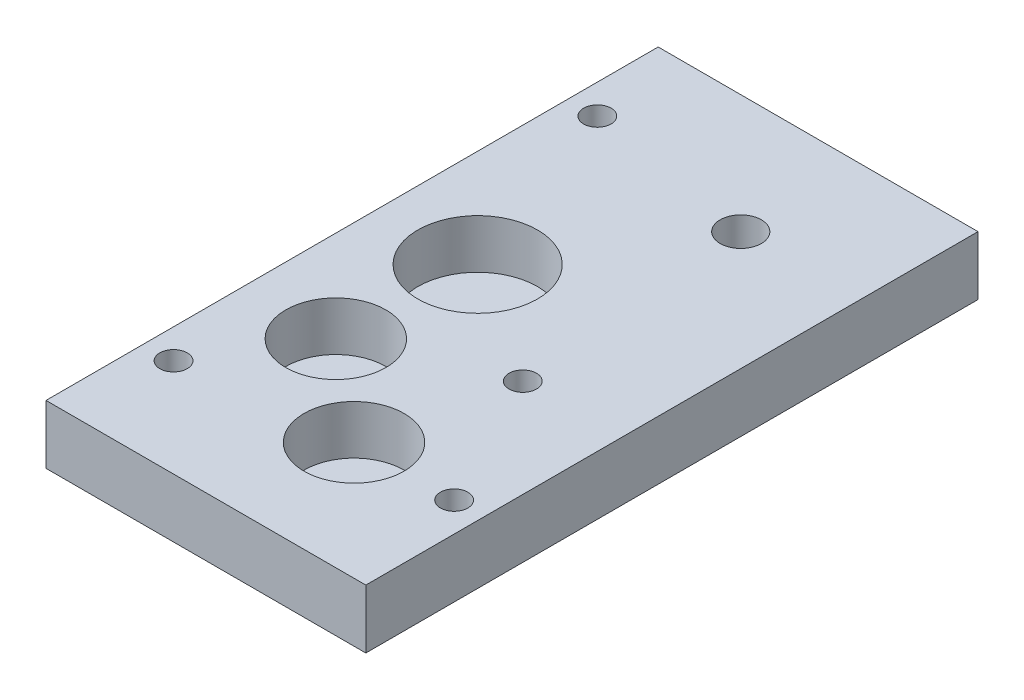
ISO-10303-21;
HEADER;
FILE_DESCRIPTION(('STEP AP214'),'2;1');
FILE_NAME('part.step','',(''),(''),'','','');
FILE_SCHEMA(('AUTOMOTIVE_DESIGN { 1 0 10303 214 1 1 1 1 }'));
ENDSEC;
DATA;
#1=APPLICATION_CONTEXT('core data for automotive mechanical design processes');
#2=APPLICATION_PROTOCOL_DEFINITION('international standard','automotive_design',2000,#1);
#3=PRODUCT_CONTEXT('',#1,'mechanical');
#4=PRODUCT('Part','Part','',(#3));
#5=PRODUCT_RELATED_PRODUCT_CATEGORY('part','',(#4));
#6=PRODUCT_DEFINITION_FORMATION('','',#4);
#7=PRODUCT_DEFINITION_CONTEXT('part definition',#1,'design');
#8=PRODUCT_DEFINITION('design','',#6,#7);
#9=PRODUCT_DEFINITION_SHAPE('','',#8);
#10=(LENGTH_UNIT() NAMED_UNIT(*) SI_UNIT(.MILLI.,.METRE.));
#11=(NAMED_UNIT(*) PLANE_ANGLE_UNIT() SI_UNIT($,.RADIAN.));
#12=(NAMED_UNIT(*) SI_UNIT($,.STERADIAN.) SOLID_ANGLE_UNIT());
#13=UNCERTAINTY_MEASURE_WITH_UNIT(LENGTH_MEASURE(1.E-05),#10,'distance_accuracy_value','');
#14=(GEOMETRIC_REPRESENTATION_CONTEXT(3) GLOBAL_UNCERTAINTY_ASSIGNED_CONTEXT((#13)) GLOBAL_UNIT_ASSIGNED_CONTEXT((#10,
#11,#12)) REPRESENTATION_CONTEXT('',''));
#15=CARTESIAN_POINT('',(0.,0.,0.));
#16=DIRECTION('',(0.,0.,1.));
#17=DIRECTION('',(1.,0.,0.));
#18=AXIS2_PLACEMENT_3D('',#15,#16,#17);
#19=CARTESIAN_POINT('',(-5.,3.,-14.2));
#20=DIRECTION('',(0.,0.,-1.));
#21=DIRECTION('',(-1.,0.,0.));
#22=AXIS2_PLACEMENT_3D('',#19,#20,#21);
#23=PLANE('',#22);
#24=DIRECTION('',(1.,0.,0.));
#25=VECTOR('',#24,1.);
#26=CARTESIAN_POINT('',(-5.,0.,-14.2));
#27=LINE('',#26,#25);
#28=CARTESIAN_POINT('',(-5.,0.,-14.2));
#29=VERTEX_POINT('',#28);
#30=CARTESIAN_POINT('',(11.3,0.,-14.2));
#31=VERTEX_POINT('',#30);
#32=EDGE_CURVE('E109',#29,#31,#27,.T.);
#33=ORIENTED_EDGE('',*,*,#32,.F.);
#34=DIRECTION('',(0.,-1.,0.));
#35=VECTOR('',#34,1.);
#36=CARTESIAN_POINT('',(-5.,3.,-14.2));
#37=LINE('',#36,#35);
#38=CARTESIAN_POINT('',(-5.,3.,-14.2));
#39=VERTEX_POINT('',#38);
#40=EDGE_CURVE('E12',#39,#29,#37,.T.);
#41=ORIENTED_EDGE('',*,*,#40,.F.);
#42=DIRECTION('',(1.,0.,0.));
#43=VECTOR('',#42,1.);
#44=CARTESIAN_POINT('',(-5.,3.,-14.2));
#45=LINE('',#44,#43);
#46=CARTESIAN_POINT('',(11.3,3.,-14.2));
#47=VERTEX_POINT('',#46);
#48=EDGE_CURVE('E103',#39,#47,#45,.T.);
#49=ORIENTED_EDGE('',*,*,#48,.T.);
#50=DIRECTION('',(0.,-1.,0.));
#51=VECTOR('',#50,1.);
#52=CARTESIAN_POINT('',(11.3,3.,-14.2));
#53=LINE('',#52,#51);
#54=EDGE_CURVE('E82',#47,#31,#53,.T.);
#55=ORIENTED_EDGE('',*,*,#54,.T.);
#56=EDGE_LOOP('',(#33,#41,#49,#55));
#57=FACE_BOUND('',#56,.T.);
#58=ADVANCED_FACE('F41',(#57),#23,.T.);
#59=CARTESIAN_POINT('',(-5.,3.,-14.2));
#60=DIRECTION('',(1.,0.,0.));
#61=DIRECTION('',(0.,0.,-1.));
#62=AXIS2_PLACEMENT_3D('',#59,#60,#61);
#63=PLANE('',#62);
#64=DIRECTION('',(0.,0.,1.));
#65=VECTOR('',#64,1.);
#66=CARTESIAN_POINT('',(-5.,0.,-14.2));
#67=LINE('',#66,#65);
#68=CARTESIAN_POINT('',(-5.,0.,17.));
#69=VERTEX_POINT('',#68);
#70=EDGE_CURVE('E74',#29,#69,#67,.T.);
#71=ORIENTED_EDGE('',*,*,#70,.T.);
#72=DIRECTION('',(0.,-1.,0.));
#73=VECTOR('',#72,1.);
#74=CARTESIAN_POINT('',(-5.,3.,17.));
#75=LINE('',#74,#73);
#76=CARTESIAN_POINT('',(-5.,3.,17.));
#77=VERTEX_POINT('',#76);
#78=EDGE_CURVE('E50',#77,#69,#75,.T.);
#79=ORIENTED_EDGE('',*,*,#78,.F.);
#80=DIRECTION('',(0.,0.,1.));
#81=VECTOR('',#80,1.);
#82=CARTESIAN_POINT('',(-5.,3.,-14.2));
#83=LINE('',#82,#81);
#84=EDGE_CURVE('E92',#39,#77,#83,.T.);
#85=ORIENTED_EDGE('',*,*,#84,.F.);
#86=ORIENTED_EDGE('',*,*,#40,.T.);
#87=EDGE_LOOP('',(#71,#79,#85,#86));
#88=FACE_BOUND('',#87,.T.);
#89=ADVANCED_FACE('F191',(#88),#63,.F.);
#90=CARTESIAN_POINT('',(-5.,3.,17.));
#91=DIRECTION('',(0.,0.,-1.));
#92=DIRECTION('',(-1.,0.,0.));
#93=AXIS2_PLACEMENT_3D('',#90,#91,#92);
#94=PLANE('',#93);
#95=DIRECTION('',(1.,0.,0.));
#96=VECTOR('',#95,1.);
#97=CARTESIAN_POINT('',(-5.,0.,17.));
#98=LINE('',#97,#96);
#99=CARTESIAN_POINT('',(11.3,0.,17.));
#100=VERTEX_POINT('',#99);
#101=EDGE_CURVE('E99',#69,#100,#98,.T.);
#102=ORIENTED_EDGE('',*,*,#101,.T.);
#103=DIRECTION('',(0.,-1.,0.));
#104=VECTOR('',#103,1.);
#105=CARTESIAN_POINT('',(11.3,3.,17.));
#106=LINE('',#105,#104);
#107=CARTESIAN_POINT('',(11.3,3.,17.));
#108=VERTEX_POINT('',#107);
#109=EDGE_CURVE('E96',#108,#100,#106,.T.);
#110=ORIENTED_EDGE('',*,*,#109,.F.);
#111=DIRECTION('',(1.,0.,0.));
#112=VECTOR('',#111,1.);
#113=CARTESIAN_POINT('',(-5.,3.,17.));
#114=LINE('',#113,#112);
#115=EDGE_CURVE('E87',#77,#108,#114,.T.);
#116=ORIENTED_EDGE('',*,*,#115,.F.);
#117=ORIENTED_EDGE('',*,*,#78,.T.);
#118=EDGE_LOOP('',(#102,#110,#116,#117));
#119=FACE_BOUND('',#118,.T.);
#120=ADVANCED_FACE('F97',(#119),#94,.F.);
#121=CARTESIAN_POINT('',(11.3,3.,-14.2));
#122=DIRECTION('',(1.,0.,0.));
#123=DIRECTION('',(0.,0.,-1.));
#124=AXIS2_PLACEMENT_3D('',#121,#122,#123);
#125=PLANE('',#124);
#126=DIRECTION('',(0.,0.,1.));
#127=VECTOR('',#126,1.);
#128=CARTESIAN_POINT('',(11.3,0.,-14.2));
#129=LINE('',#128,#127);
#130=EDGE_CURVE('E112',#31,#100,#129,.T.);
#131=ORIENTED_EDGE('',*,*,#130,.F.);
#132=ORIENTED_EDGE('',*,*,#54,.F.);
#133=DIRECTION('',(0.,0.,1.));
#134=VECTOR('',#133,1.);
#135=CARTESIAN_POINT('',(11.3,3.,-14.2));
#136=LINE('',#135,#134);
#137=EDGE_CURVE('E91',#47,#108,#136,.T.);
#138=ORIENTED_EDGE('',*,*,#137,.T.);
#139=ORIENTED_EDGE('',*,*,#109,.T.);
#140=EDGE_LOOP('',(#131,#132,#138,#139));
#141=FACE_BOUND('',#140,.T.);
#142=ADVANCED_FACE('F102',(#141),#125,.T.);
#143=CARTESIAN_POINT('',(0.,3.,0.));
#144=DIRECTION('',(0.,-1.,0.));
#145=DIRECTION('',(0.,0.,-1.));
#146=AXIS2_PLACEMENT_3D('',#143,#144,#145);
#147=PLANE('',#146);
#148=CARTESIAN_POINT('',(-3.50000000000003,3.,-9.6));
#149=DIRECTION('',(0.,-1.,0.));
#150=DIRECTION('',(0.,0.,-1.));
#151=AXIS2_PLACEMENT_3D('',#148,#149,#150);
#152=CIRCLE('',#151,0.7);
#153=CARTESIAN_POINT('',(-3.50000000000003,3.,-10.3));
#154=VERTEX_POINT('',#153);
#155=EDGE_CURVE('E123',#154,#154,#152,.T.);
#156=ORIENTED_EDGE('',*,*,#155,.T.);
#157=EDGE_LOOP('',(#156));
#158=FACE_BOUND('',#157,.T.);
#159=CARTESIAN_POINT('',(9.80000000000005,3.,11.));
#160=DIRECTION('',(0.,-1.,0.));
#161=DIRECTION('',(0.,0.,-1.));
#162=AXIS2_PLACEMENT_3D('',#159,#160,#161);
#163=CIRCLE('',#162,0.699999999999999);
#164=CARTESIAN_POINT('',(9.80000000000005,3.,10.3));
#165=VERTEX_POINT('',#164);
#166=EDGE_CURVE('E214',#165,#165,#163,.T.);
#167=ORIENTED_EDGE('',*,*,#166,.T.);
#168=EDGE_LOOP('',(#167));
#169=FACE_BOUND('',#168,.T.);
#170=CARTESIAN_POINT('',(-3.50000000000022,3.,12.));
#171=DIRECTION('',(0.,-1.,0.));
#172=DIRECTION('',(0.,0.,-1.));
#173=AXIS2_PLACEMENT_3D('',#170,#171,#172);
#174=CIRCLE('',#173,0.7);
#175=CARTESIAN_POINT('',(-3.50000000000022,3.,11.3));
#176=VERTEX_POINT('',#175);
#177=EDGE_CURVE('E218',#176,#176,#174,.T.);
#178=ORIENTED_EDGE('',*,*,#177,.T.);
#179=EDGE_LOOP('',(#178));
#180=FACE_BOUND('',#179,.T.);
#181=CARTESIAN_POINT('',(6.29999999999997,3.,4.00000000000006));
#182=DIRECTION('',(0.,-1.,0.));
#183=DIRECTION('',(0.,0.,-1.));
#184=AXIS2_PLACEMENT_3D('',#181,#182,#183);
#185=CIRCLE('',#184,0.7);
#186=CARTESIAN_POINT('',(6.29999999999997,3.,3.30000000000006));
#187=VERTEX_POINT('',#186);
#188=EDGE_CURVE('E222',#187,#187,#185,.T.);
#189=ORIENTED_EDGE('',*,*,#188,.T.);
#190=EDGE_LOOP('',(#189));
#191=FACE_BOUND('',#190,.T.);
#192=CARTESIAN_POINT('',(5.25646038971304,3.,-8.15227723837811));
#193=DIRECTION('',(0.,-1.,0.));
#194=DIRECTION('',(0.,0.,-1.));
#195=AXIS2_PLACEMENT_3D('',#192,#193,#194);
#196=CIRCLE('',#195,1.05);
#197=CARTESIAN_POINT('',(5.25646038971304,3.,-9.20227723837811));
#198=VERTEX_POINT('',#197);
#199=EDGE_CURVE('E158',#198,#198,#196,.T.);
#200=ORIENTED_EDGE('',*,*,#199,.T.);
#201=EDGE_LOOP('',(#200));
#202=FACE_BOUND('',#201,.T.);
#203=CARTESIAN_POINT('',(4.7,3.,11.));
#204=DIRECTION('',(0.,-1.,0.));
#205=DIRECTION('',(0.,0.,-1.));
#206=AXIS2_PLACEMENT_3D('',#203,#204,#205);
#207=CIRCLE('',#206,2.55);
#208=CARTESIAN_POINT('',(4.7,3.,8.44999999999999));
#209=VERTEX_POINT('',#208);
#210=EDGE_CURVE('E159',#209,#209,#207,.T.);
#211=ORIENTED_EDGE('',*,*,#210,.T.);
#212=EDGE_LOOP('',(#211));
#213=FACE_BOUND('',#212,.T.);
#214=CARTESIAN_POINT('',(-0.337099262884606,3.,6.89176059414158));
#215=DIRECTION('',(0.,-1.,0.));
#216=DIRECTION('',(0.,0.,-1.));
#217=AXIS2_PLACEMENT_3D('',#214,#215,#216);
#218=CIRCLE('',#217,2.55);
#219=CARTESIAN_POINT('',(-0.337099262884606,3.,4.34176059414158));
#220=VERTEX_POINT('',#219);
#221=EDGE_CURVE('E151',#220,#220,#218,.T.);
#222=ORIENTED_EDGE('',*,*,#221,.T.);
#223=EDGE_LOOP('',(#222));
#224=FACE_BOUND('',#223,.T.);
#225=CARTESIAN_POINT('',(0.,3.,0.));
#226=DIRECTION('',(0.,-1.,0.));
#227=DIRECTION('',(0.,0.,-1.));
#228=AXIS2_PLACEMENT_3D('',#225,#226,#227);
#229=CIRCLE('',#228,3.05);
#230=CARTESIAN_POINT('',(0.,3.,-3.05));
#231=VERTEX_POINT('',#230);
#232=EDGE_CURVE('E162',#231,#231,#229,.T.);
#233=ORIENTED_EDGE('',*,*,#232,.T.);
#234=EDGE_LOOP('',(#233));
#235=FACE_BOUND('',#234,.T.);
#236=ORIENTED_EDGE('',*,*,#48,.F.);
#237=ORIENTED_EDGE('',*,*,#84,.T.);
#238=ORIENTED_EDGE('',*,*,#115,.T.);
#239=ORIENTED_EDGE('',*,*,#137,.F.);
#240=EDGE_LOOP('',(#236,#237,#238,#239));
#241=FACE_BOUND('',#240,.T.);
#242=ADVANCED_FACE('F90',(#158,#169,#180,#191,#202,#213,#224,#235,#241),#147,.F.);
#243=CARTESIAN_POINT('',(0.,0.,0.));
#244=DIRECTION('',(0.,-1.,0.));
#245=DIRECTION('',(0.,0.,-1.));
#246=AXIS2_PLACEMENT_3D('',#243,#244,#245);
#247=PLANE('',#246);
#248=CARTESIAN_POINT('',(-3.50000000000003,0.,-9.6));
#249=DIRECTION('',(0.,-1.,0.));
#250=DIRECTION('',(0.,0.,-1.));
#251=AXIS2_PLACEMENT_3D('',#248,#249,#250);
#252=CIRCLE('',#251,1.);
#253=CARTESIAN_POINT('',(-3.50000000000003,0.,-10.6));
#254=VERTEX_POINT('',#253);
#255=EDGE_CURVE('E134',#254,#254,#252,.T.);
#256=ORIENTED_EDGE('',*,*,#255,.F.);
#257=EDGE_LOOP('',(#256));
#258=FACE_BOUND('',#257,.T.);
#259=CARTESIAN_POINT('',(6.29999999999997,0.,4.00000000000006));
#260=DIRECTION('',(0.,-1.,0.));
#261=DIRECTION('',(0.,0.,-1.));
#262=AXIS2_PLACEMENT_3D('',#259,#260,#261);
#263=CIRCLE('',#262,1.);
#264=CARTESIAN_POINT('',(6.29999999999997,0.,3.00000000000006));
#265=VERTEX_POINT('',#264);
#266=EDGE_CURVE('E327',#265,#265,#263,.T.);
#267=ORIENTED_EDGE('',*,*,#266,.F.);
#268=EDGE_LOOP('',(#267));
#269=FACE_BOUND('',#268,.T.);
#270=CARTESIAN_POINT('',(9.80000000000005,0.,11.));
#271=DIRECTION('',(0.,-1.,0.));
#272=DIRECTION('',(0.,0.,-1.));
#273=AXIS2_PLACEMENT_3D('',#270,#271,#272);
#274=CIRCLE('',#273,1.);
#275=CARTESIAN_POINT('',(9.80000000000005,0.,10.));
#276=VERTEX_POINT('',#275);
#277=EDGE_CURVE('E150',#276,#276,#274,.T.);
#278=ORIENTED_EDGE('',*,*,#277,.F.);
#279=EDGE_LOOP('',(#278));
#280=FACE_BOUND('',#279,.T.);
#281=CARTESIAN_POINT('',(-3.50000000000022,0.,12.));
#282=DIRECTION('',(0.,-1.,0.));
#283=DIRECTION('',(0.,0.,-1.));
#284=AXIS2_PLACEMENT_3D('',#281,#282,#283);
#285=CIRCLE('',#284,1.);
#286=CARTESIAN_POINT('',(-3.50000000000022,0.,11.));
#287=VERTEX_POINT('',#286);
#288=EDGE_CURVE('E147',#287,#287,#285,.T.);
#289=ORIENTED_EDGE('',*,*,#288,.F.);
#290=EDGE_LOOP('',(#289));
#291=FACE_BOUND('',#290,.T.);
#292=ORIENTED_EDGE('',*,*,#32,.T.);
#293=ORIENTED_EDGE('',*,*,#130,.T.);
#294=ORIENTED_EDGE('',*,*,#101,.F.);
#295=ORIENTED_EDGE('',*,*,#70,.F.);
#296=EDGE_LOOP('',(#292,#293,#294,#295));
#297=FACE_BOUND('',#296,.T.);
#298=ADVANCED_FACE('F177',(#258,#269,#280,#291,#297),#247,.T.);
#299=CARTESIAN_POINT('',(0.,0.5,0.));
#300=DIRECTION('',(0.,1.,0.));
#301=DIRECTION('',(0.,0.,1.));
#302=AXIS2_PLACEMENT_3D('',#299,#300,#301);
#303=CYLINDRICAL_SURFACE('',#302,3.05);
#304=CARTESIAN_POINT('',(0.,0.5,0.));
#305=DIRECTION('',(0.,-1.,0.));
#306=DIRECTION('',(0.,0.,-1.));
#307=AXIS2_PLACEMENT_3D('',#304,#305,#306);
#308=CIRCLE('',#307,3.05);
#309=CARTESIAN_POINT('',(0.,0.5,-3.05));
#310=VERTEX_POINT('',#309);
#311=EDGE_CURVE('E113',#310,#310,#308,.T.);
#312=ORIENTED_EDGE('',*,*,#311,.T.);
#313=EDGE_LOOP('',(#312));
#314=FACE_BOUND('',#313,.T.);
#315=ORIENTED_EDGE('',*,*,#232,.F.);
#316=EDGE_LOOP('',(#315));
#317=FACE_BOUND('',#316,.T.);
#318=ADVANCED_FACE('F174',(#314,#317),#303,.F.);
#319=CARTESIAN_POINT('',(0.,0.5,0.));
#320=DIRECTION('',(0.,-1.,0.));
#321=DIRECTION('',(0.,0.,-1.));
#322=AXIS2_PLACEMENT_3D('',#319,#320,#321);
#323=PLANE('',#322);
#324=ORIENTED_EDGE('',*,*,#311,.F.);
#325=EDGE_LOOP('',(#324));
#326=FACE_BOUND('',#325,.T.);
#327=ADVANCED_FACE('F176',(#326),#323,.F.);
#328=CARTESIAN_POINT('',(-0.337099262884606,0.5,6.89176059414158));
#329=DIRECTION('',(0.,1.,0.));
#330=DIRECTION('',(0.,0.,1.));
#331=AXIS2_PLACEMENT_3D('',#328,#329,#330);
#332=CYLINDRICAL_SURFACE('',#331,2.55);
#333=CARTESIAN_POINT('',(-0.337099262884606,0.5,6.89176059414158));
#334=DIRECTION('',(0.,-1.,0.));
#335=DIRECTION('',(0.,0.,-1.));
#336=AXIS2_PLACEMENT_3D('',#333,#334,#335);
#337=CIRCLE('',#336,2.55);
#338=CARTESIAN_POINT('',(-0.337099262884606,0.5,4.34176059414158));
#339=VERTEX_POINT('',#338);
#340=EDGE_CURVE('E155',#339,#339,#337,.T.);
#341=ORIENTED_EDGE('',*,*,#340,.T.);
#342=EDGE_LOOP('',(#341));
#343=FACE_BOUND('',#342,.T.);
#344=ORIENTED_EDGE('',*,*,#221,.F.);
#345=EDGE_LOOP('',(#344));
#346=FACE_BOUND('',#345,.T.);
#347=ADVANCED_FACE('F184',(#343,#346),#332,.F.);
#348=CARTESIAN_POINT('',(-0.337099262884606,0.5,6.89176059414158));
#349=DIRECTION('',(0.,-1.,0.));
#350=DIRECTION('',(0.,0.,-1.));
#351=AXIS2_PLACEMENT_3D('',#348,#349,#350);
#352=PLANE('',#351);
#353=ORIENTED_EDGE('',*,*,#340,.F.);
#354=EDGE_LOOP('',(#353));
#355=FACE_BOUND('',#354,.T.);
#356=ADVANCED_FACE('F230',(#355),#352,.F.);
#357=CARTESIAN_POINT('',(4.7,0.5,11.));
#358=DIRECTION('',(0.,1.,0.));
#359=DIRECTION('',(0.,0.,1.));
#360=AXIS2_PLACEMENT_3D('',#357,#358,#359);
#361=CYLINDRICAL_SURFACE('',#360,2.55);
#362=CARTESIAN_POINT('',(4.7,0.5,11.));
#363=DIRECTION('',(0.,-1.,0.));
#364=DIRECTION('',(0.,0.,-1.));
#365=AXIS2_PLACEMENT_3D('',#362,#363,#364);
#366=CIRCLE('',#365,2.55);
#367=CARTESIAN_POINT('',(4.7,0.5,8.44999999999999));
#368=VERTEX_POINT('',#367);
#369=EDGE_CURVE('E154',#368,#368,#366,.T.);
#370=ORIENTED_EDGE('',*,*,#369,.T.);
#371=EDGE_LOOP('',(#370));
#372=FACE_BOUND('',#371,.T.);
#373=ORIENTED_EDGE('',*,*,#210,.F.);
#374=EDGE_LOOP('',(#373));
#375=FACE_BOUND('',#374,.T.);
#376=ADVANCED_FACE('F236',(#372,#375),#361,.F.);
#377=CARTESIAN_POINT('',(4.7,0.5,11.));
#378=DIRECTION('',(0.,-1.,0.));
#379=DIRECTION('',(0.,0.,-1.));
#380=AXIS2_PLACEMENT_3D('',#377,#378,#379);
#381=PLANE('',#380);
#382=ORIENTED_EDGE('',*,*,#369,.F.);
#383=EDGE_LOOP('',(#382));
#384=FACE_BOUND('',#383,.T.);
#385=ADVANCED_FACE('F245',(#384),#381,.F.);
#386=CARTESIAN_POINT('',(5.25646038971304,0.5,-8.15227723837811));
#387=DIRECTION('',(0.,1.,0.));
#388=DIRECTION('',(0.,0.,1.));
#389=AXIS2_PLACEMENT_3D('',#386,#387,#388);
#390=CYLINDRICAL_SURFACE('',#389,1.05);
#391=CARTESIAN_POINT('',(5.25646038971304,0.5,-8.15227723837811));
#392=DIRECTION('',(0.,-1.,0.));
#393=DIRECTION('',(0.,0.,-1.));
#394=AXIS2_PLACEMENT_3D('',#391,#392,#393);
#395=CIRCLE('',#394,1.05);
#396=CARTESIAN_POINT('',(5.25646038971304,0.5,-9.20227723837811));
#397=VERTEX_POINT('',#396);
#398=EDGE_CURVE('E146',#397,#397,#395,.T.);
#399=ORIENTED_EDGE('',*,*,#398,.T.);
#400=EDGE_LOOP('',(#399));
#401=FACE_BOUND('',#400,.T.);
#402=ORIENTED_EDGE('',*,*,#199,.F.);
#403=EDGE_LOOP('',(#402));
#404=FACE_BOUND('',#403,.T.);
#405=ADVANCED_FACE('F249',(#401,#404),#390,.F.);
#406=CARTESIAN_POINT('',(5.25646038971304,0.5,-8.15227723837811));
#407=DIRECTION('',(0.,-1.,0.));
#408=DIRECTION('',(0.,0.,-1.));
#409=AXIS2_PLACEMENT_3D('',#406,#407,#408);
#410=PLANE('',#409);
#411=ORIENTED_EDGE('',*,*,#398,.F.);
#412=EDGE_LOOP('',(#411));
#413=FACE_BOUND('',#412,.T.);
#414=ADVANCED_FACE('F253',(#413),#410,.F.);
#415=CARTESIAN_POINT('',(-3.50000000000022,1.5,12.));
#416=DIRECTION('',(0.,-1.,0.));
#417=DIRECTION('',(0.,0.,-1.));
#418=AXIS2_PLACEMENT_3D('',#415,#416,#417);
#419=CYLINDRICAL_SURFACE('',#418,1.);
#420=CARTESIAN_POINT('',(-3.50000000000022,1.5,12.));
#421=DIRECTION('',(0.,-1.,0.));
#422=DIRECTION('',(0.,0.,-1.));
#423=AXIS2_PLACEMENT_3D('',#420,#421,#422);
#424=CIRCLE('',#423,1.);
#425=CARTESIAN_POINT('',(-3.50000000000022,1.5,11.));
#426=VERTEX_POINT('',#425);
#427=EDGE_CURVE('E143',#426,#426,#424,.T.);
#428=ORIENTED_EDGE('',*,*,#427,.F.);
#429=EDGE_LOOP('',(#428));
#430=FACE_BOUND('',#429,.T.);
#431=ORIENTED_EDGE('',*,*,#288,.T.);
#432=EDGE_LOOP('',(#431));
#433=FACE_BOUND('',#432,.T.);
#434=ADVANCED_FACE('F240',(#430,#433),#419,.F.);
#435=CARTESIAN_POINT('',(-3.50000000000022,1.5,12.));
#436=DIRECTION('',(0.,-1.,0.));
#437=DIRECTION('',(0.,0.,-1.));
#438=AXIS2_PLACEMENT_3D('',#435,#436,#437);
#439=PLANE('',#438);
#440=CARTESIAN_POINT('',(-3.50000000000022,1.5,12.));
#441=DIRECTION('',(0.,-1.,0.));
#442=DIRECTION('',(0.,0.,-1.));
#443=AXIS2_PLACEMENT_3D('',#440,#441,#442);
#444=CIRCLE('',#443,0.7);
#445=CARTESIAN_POINT('',(-3.50000000000022,1.5,11.3));
#446=VERTEX_POINT('',#445);
#447=EDGE_CURVE('E44',#446,#446,#444,.T.);
#448=ORIENTED_EDGE('',*,*,#447,.F.);
#449=EDGE_LOOP('',(#448));
#450=FACE_BOUND('',#449,.T.);
#451=ORIENTED_EDGE('',*,*,#427,.T.);
#452=EDGE_LOOP('',(#451));
#453=FACE_BOUND('',#452,.T.);
#454=ADVANCED_FACE('F260',(#450,#453),#439,.T.);
#455=CARTESIAN_POINT('',(9.80000000000005,1.5,11.));
#456=DIRECTION('',(0.,-1.,0.));
#457=DIRECTION('',(0.,0.,-1.));
#458=AXIS2_PLACEMENT_3D('',#455,#456,#457);
#459=CYLINDRICAL_SURFACE('',#458,1.);
#460=CARTESIAN_POINT('',(9.80000000000005,1.5,11.));
#461=DIRECTION('',(0.,-1.,0.));
#462=DIRECTION('',(0.,0.,-1.));
#463=AXIS2_PLACEMENT_3D('',#460,#461,#462);
#464=CIRCLE('',#463,1.);
#465=CARTESIAN_POINT('',(9.80000000000005,1.5,10.));
#466=VERTEX_POINT('',#465);
#467=EDGE_CURVE('E324',#466,#466,#464,.T.);
#468=ORIENTED_EDGE('',*,*,#467,.F.);
#469=EDGE_LOOP('',(#468));
#470=FACE_BOUND('',#469,.T.);
#471=ORIENTED_EDGE('',*,*,#277,.T.);
#472=EDGE_LOOP('',(#471));
#473=FACE_BOUND('',#472,.T.);
#474=ADVANCED_FACE('F267',(#470,#473),#459,.F.);
#475=CARTESIAN_POINT('',(9.80000000000005,1.5,11.));
#476=DIRECTION('',(0.,-1.,0.));
#477=DIRECTION('',(0.,0.,-1.));
#478=AXIS2_PLACEMENT_3D('',#475,#476,#477);
#479=PLANE('',#478);
#480=CARTESIAN_POINT('',(9.80000000000005,1.5,11.));
#481=DIRECTION('',(0.,-1.,0.));
#482=DIRECTION('',(0.,0.,-1.));
#483=AXIS2_PLACEMENT_3D('',#480,#481,#482);
#484=CIRCLE('',#483,0.699999999999999);
#485=CARTESIAN_POINT('',(9.80000000000005,1.5,10.3));
#486=VERTEX_POINT('',#485);
#487=EDGE_CURVE('E125',#486,#486,#484,.T.);
#488=ORIENTED_EDGE('',*,*,#487,.F.);
#489=EDGE_LOOP('',(#488));
#490=FACE_BOUND('',#489,.T.);
#491=ORIENTED_EDGE('',*,*,#467,.T.);
#492=EDGE_LOOP('',(#491));
#493=FACE_BOUND('',#492,.T.);
#494=ADVANCED_FACE('F277',(#490,#493),#479,.T.);
#495=CARTESIAN_POINT('',(6.29999999999997,1.5,4.00000000000006));
#496=DIRECTION('',(0.,-1.,0.));
#497=DIRECTION('',(0.,0.,-1.));
#498=AXIS2_PLACEMENT_3D('',#495,#496,#497);
#499=CYLINDRICAL_SURFACE('',#498,1.);
#500=CARTESIAN_POINT('',(6.29999999999997,1.5,4.00000000000006));
#501=DIRECTION('',(0.,-1.,0.));
#502=DIRECTION('',(0.,0.,-1.));
#503=AXIS2_PLACEMENT_3D('',#500,#501,#502);
#504=CIRCLE('',#503,1.);
#505=CARTESIAN_POINT('',(6.29999999999997,1.5,3.00000000000006));
#506=VERTEX_POINT('',#505);
#507=EDGE_CURVE('E139',#506,#506,#504,.T.);
#508=ORIENTED_EDGE('',*,*,#507,.F.);
#509=EDGE_LOOP('',(#508));
#510=FACE_BOUND('',#509,.T.);
#511=ORIENTED_EDGE('',*,*,#266,.T.);
#512=EDGE_LOOP('',(#511));
#513=FACE_BOUND('',#512,.T.);
#514=ADVANCED_FACE('F293',(#510,#513),#499,.F.);
#515=CARTESIAN_POINT('',(6.29999999999997,1.5,4.00000000000006));
#516=DIRECTION('',(0.,-1.,0.));
#517=DIRECTION('',(0.,0.,-1.));
#518=AXIS2_PLACEMENT_3D('',#515,#516,#517);
#519=PLANE('',#518);
#520=CARTESIAN_POINT('',(6.29999999999997,1.5,4.00000000000006));
#521=DIRECTION('',(0.,-1.,0.));
#522=DIRECTION('',(0.,0.,-1.));
#523=AXIS2_PLACEMENT_3D('',#520,#521,#522);
#524=CIRCLE('',#523,0.7);
#525=CARTESIAN_POINT('',(6.29999999999997,1.5,3.30000000000006));
#526=VERTEX_POINT('',#525);
#527=EDGE_CURVE('E122',#526,#526,#524,.T.);
#528=ORIENTED_EDGE('',*,*,#527,.F.);
#529=EDGE_LOOP('',(#528));
#530=FACE_BOUND('',#529,.T.);
#531=ORIENTED_EDGE('',*,*,#507,.T.);
#532=EDGE_LOOP('',(#531));
#533=FACE_BOUND('',#532,.T.);
#534=ADVANCED_FACE('F289',(#530,#533),#519,.T.);
#535=CARTESIAN_POINT('',(-3.50000000000003,1.5,-9.6));
#536=DIRECTION('',(0.,-1.,0.));
#537=DIRECTION('',(0.,0.,-1.));
#538=AXIS2_PLACEMENT_3D('',#535,#536,#537);
#539=CYLINDRICAL_SURFACE('',#538,1.);
#540=CARTESIAN_POINT('',(-3.50000000000003,1.5,-9.6));
#541=DIRECTION('',(0.,-1.,0.));
#542=DIRECTION('',(0.,0.,-1.));
#543=AXIS2_PLACEMENT_3D('',#540,#541,#542);
#544=CIRCLE('',#543,1.);
#545=CARTESIAN_POINT('',(-3.50000000000003,1.5,-10.6));
#546=VERTEX_POINT('',#545);
#547=EDGE_CURVE('E130',#546,#546,#544,.T.);
#548=ORIENTED_EDGE('',*,*,#547,.F.);
#549=EDGE_LOOP('',(#548));
#550=FACE_BOUND('',#549,.T.);
#551=ORIENTED_EDGE('',*,*,#255,.T.);
#552=EDGE_LOOP('',(#551));
#553=FACE_BOUND('',#552,.T.);
#554=ADVANCED_FACE('F285',(#550,#553),#539,.F.);
#555=CARTESIAN_POINT('',(-3.50000000000003,1.5,-9.6));
#556=DIRECTION('',(0.,-1.,0.));
#557=DIRECTION('',(0.,0.,-1.));
#558=AXIS2_PLACEMENT_3D('',#555,#556,#557);
#559=PLANE('',#558);
#560=CARTESIAN_POINT('',(-3.50000000000003,1.5,-9.6));
#561=DIRECTION('',(0.,-1.,0.));
#562=DIRECTION('',(0.,0.,-1.));
#563=AXIS2_PLACEMENT_3D('',#560,#561,#562);
#564=CIRCLE('',#563,0.7);
#565=CARTESIAN_POINT('',(-3.50000000000003,1.5,-10.3));
#566=VERTEX_POINT('',#565);
#567=EDGE_CURVE('E119',#566,#566,#564,.T.);
#568=ORIENTED_EDGE('',*,*,#567,.F.);
#569=EDGE_LOOP('',(#568));
#570=FACE_BOUND('',#569,.T.);
#571=ORIENTED_EDGE('',*,*,#547,.T.);
#572=EDGE_LOOP('',(#571));
#573=FACE_BOUND('',#572,.T.);
#574=ADVANCED_FACE('F281',(#570,#573),#559,.T.);
#575=CARTESIAN_POINT('',(-3.50000000000003,3.,-9.6));
#576=DIRECTION('',(0.,-1.,0.));
#577=DIRECTION('',(0.,0.,-1.));
#578=AXIS2_PLACEMENT_3D('',#575,#576,#577);
#579=CYLINDRICAL_SURFACE('',#578,0.7);
#580=ORIENTED_EDGE('',*,*,#567,.T.);
#581=EDGE_LOOP('',(#580));
#582=FACE_BOUND('',#581,.T.);
#583=ORIENTED_EDGE('',*,*,#155,.F.);
#584=EDGE_LOOP('',(#583));
#585=FACE_BOUND('',#584,.T.);
#586=ADVANCED_FACE('F284',(#582,#585),#579,.F.);
#587=CARTESIAN_POINT('',(6.29999999999997,3.,4.00000000000006));
#588=DIRECTION('',(0.,-1.,0.));
#589=DIRECTION('',(0.,0.,-1.));
#590=AXIS2_PLACEMENT_3D('',#587,#588,#589);
#591=CYLINDRICAL_SURFACE('',#590,0.7);
#592=ORIENTED_EDGE('',*,*,#527,.T.);
#593=EDGE_LOOP('',(#592));
#594=FACE_BOUND('',#593,.T.);
#595=ORIENTED_EDGE('',*,*,#188,.F.);
#596=EDGE_LOOP('',(#595));
#597=FACE_BOUND('',#596,.T.);
#598=ADVANCED_FACE('F301',(#594,#597),#591,.F.);
#599=CARTESIAN_POINT('',(9.80000000000005,3.,11.));
#600=DIRECTION('',(0.,-1.,0.));
#601=DIRECTION('',(0.,0.,-1.));
#602=AXIS2_PLACEMENT_3D('',#599,#600,#601);
#603=CYLINDRICAL_SURFACE('',#602,0.699999999999999);
#604=ORIENTED_EDGE('',*,*,#487,.T.);
#605=EDGE_LOOP('',(#604));
#606=FACE_BOUND('',#605,.T.);
#607=ORIENTED_EDGE('',*,*,#166,.F.);
#608=EDGE_LOOP('',(#607));
#609=FACE_BOUND('',#608,.T.);
#610=ADVANCED_FACE('F304',(#606,#609),#603,.F.);
#611=CARTESIAN_POINT('',(-3.50000000000022,3.,12.));
#612=DIRECTION('',(0.,-1.,0.));
#613=DIRECTION('',(0.,0.,-1.));
#614=AXIS2_PLACEMENT_3D('',#611,#612,#613);
#615=CYLINDRICAL_SURFACE('',#614,0.7);
#616=ORIENTED_EDGE('',*,*,#447,.T.);
#617=EDGE_LOOP('',(#616));
#618=FACE_BOUND('',#617,.T.);
#619=ORIENTED_EDGE('',*,*,#177,.F.);
#620=EDGE_LOOP('',(#619));
#621=FACE_BOUND('',#620,.T.);
#622=ADVANCED_FACE('F306',(#618,#621),#615,.F.);
#623=CLOSED_SHELL('',(#58,#89,#120,#142,#242,#298,#318,#327,#347,#356,#376,#385,#405,#414,#434,
#454,#474,#494,#514,#534,#554,#574,#586,#598,#610,#622));
#624=MANIFOLD_SOLID_BREP('B2',#623);
#625=ADVANCED_BREP_SHAPE_REPRESENTATION('',(#18,#624),#14);
#626=SHAPE_DEFINITION_REPRESENTATION(#9,#625);
ENDSEC;
END-ISO-10303-21;
